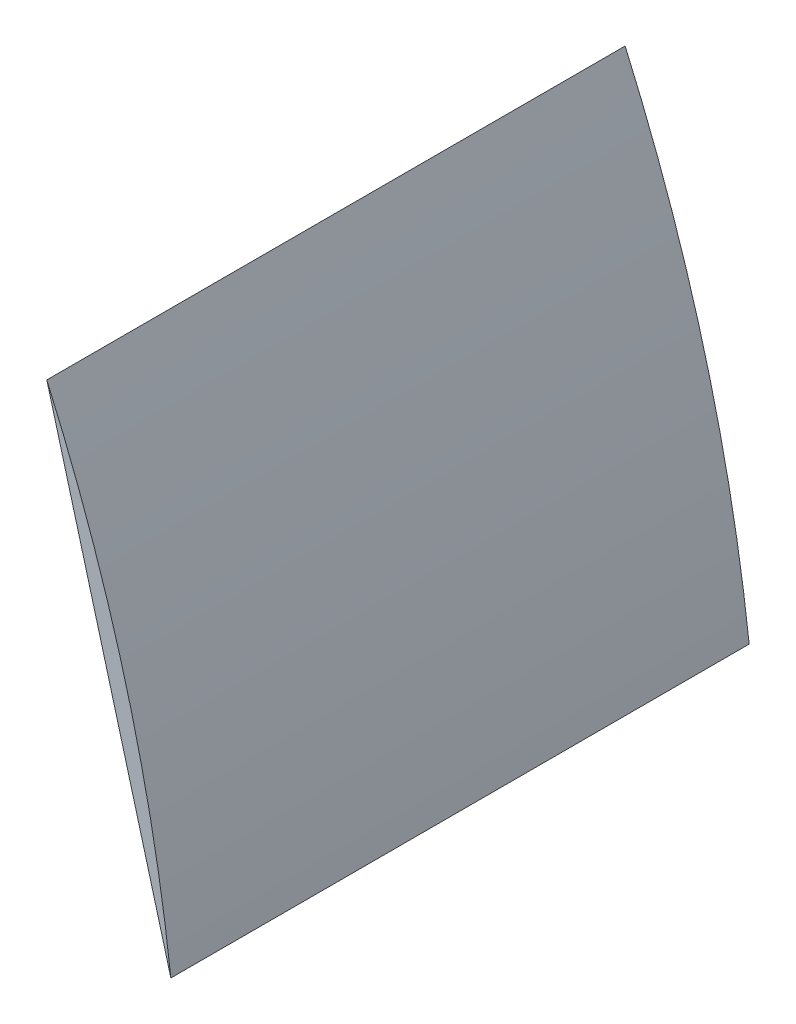
ISO-10303-21;
HEADER;
FILE_DESCRIPTION(('STEP AP214'),'2;1');
FILE_NAME('part.step','',(''),(''),'','','');
FILE_SCHEMA(('AUTOMOTIVE_DESIGN { 1 0 10303 214 1 1 1 1 }'));
ENDSEC;
DATA;
#1=APPLICATION_CONTEXT('core data for automotive mechanical design processes');
#2=APPLICATION_PROTOCOL_DEFINITION('international standard','automotive_design',2000,#1);
#3=PRODUCT_CONTEXT('',#1,'mechanical');
#4=PRODUCT('Part','Part','',(#3));
#5=PRODUCT_RELATED_PRODUCT_CATEGORY('part','',(#4));
#6=PRODUCT_DEFINITION_FORMATION('','',#4);
#7=PRODUCT_DEFINITION_CONTEXT('part definition',#1,'design');
#8=PRODUCT_DEFINITION('design','',#6,#7);
#9=PRODUCT_DEFINITION_SHAPE('','',#8);
#10=(LENGTH_UNIT() NAMED_UNIT(*) SI_UNIT(.MILLI.,.METRE.));
#11=(NAMED_UNIT(*) PLANE_ANGLE_UNIT() SI_UNIT($,.RADIAN.));
#12=(NAMED_UNIT(*) SI_UNIT($,.STERADIAN.) SOLID_ANGLE_UNIT());
#13=UNCERTAINTY_MEASURE_WITH_UNIT(LENGTH_MEASURE(1.E-05),#10,'distance_accuracy_value','');
#14=(GEOMETRIC_REPRESENTATION_CONTEXT(3) GLOBAL_UNCERTAINTY_ASSIGNED_CONTEXT((#13)) GLOBAL_UNIT_ASSIGNED_CONTEXT((#10,
#11,#12)) REPRESENTATION_CONTEXT('',''));
#15=CARTESIAN_POINT('',(0.,0.,0.));
#16=DIRECTION('',(0.,0.,1.));
#17=DIRECTION('',(1.,0.,0.));
#18=AXIS2_PLACEMENT_3D('',#15,#16,#17);
#19=CARTESIAN_POINT('',(-5.137,13.719,7.139));
#20=DIRECTION('',(0.,0.,-1.));
#21=DIRECTION('',(-1.,0.,0.));
#22=AXIS2_PLACEMENT_3D('',#19,#20,#21);
#23=CYLINDRICAL_SURFACE('',#22,19.731);
#24=CARTESIAN_POINT('',(-5.137,13.719,0.));
#25=DIRECTION('',(0.,0.,1.));
#26=DIRECTION('',(-1.,0.,0.));
#27=AXIS2_PLACEMENT_3D('',#24,#25,#26);
#28=CIRCLE('',#27,19.731);
#29=CARTESIAN_POINT('',(14.4584856264279,16.0275285496302,0.));
#30=VERTEX_POINT('',#29);
#31=CARTESIAN_POINT('',(12.9273076725018,21.6558223687564,0.));
#32=VERTEX_POINT('',#31);
#33=EDGE_CURVE('E74',#30,#32,#28,.T.);
#34=ORIENTED_EDGE('',*,*,#33,.T.);
#35=DIRECTION('',(0.,0.,-1.));
#36=VECTOR('',#35,1.);
#37=CARTESIAN_POINT('',(12.9273076725018,21.6558223687564,7.139));
#38=LINE('',#37,#36);
#39=CARTESIAN_POINT('',(12.9273076725018,21.6558223687564,7.139));
#40=VERTEX_POINT('',#39);
#41=EDGE_CURVE('E11',#40,#32,#38,.T.);
#42=ORIENTED_EDGE('',*,*,#41,.F.);
#43=CARTESIAN_POINT('',(-5.137,13.719,7.139));
#44=DIRECTION('',(0.,0.,1.));
#45=DIRECTION('',(-1.,0.,0.));
#46=AXIS2_PLACEMENT_3D('',#43,#44,#45);
#47=CIRCLE('',#46,19.731);
#48=CARTESIAN_POINT('',(14.4584856264279,16.0275285496302,7.139));
#49=VERTEX_POINT('',#48);
#50=EDGE_CURVE('E72',#49,#40,#47,.T.);
#51=ORIENTED_EDGE('',*,*,#50,.F.);
#52=DIRECTION('',(0.,0.,-1.));
#53=VECTOR('',#52,1.);
#54=CARTESIAN_POINT('',(14.4584856264279,16.0275285496302,7.139));
#55=LINE('',#54,#53);
#56=EDGE_CURVE('E47',#49,#30,#55,.T.);
#57=ORIENTED_EDGE('',*,*,#56,.T.);
#58=EDGE_LOOP('',(#34,#42,#51,#57));
#59=FACE_BOUND('',#58,.T.);
#60=ADVANCED_FACE('F41',(#59),#23,.T.);
#61=CARTESIAN_POINT('',(14.4584856264279,16.0275285496302,7.139));
#62=DIRECTION('',(0.964929496189798,0.262509175807063,0.));
#63=DIRECTION('',(-0.262509175807063,0.964929496189798,0.));
#64=AXIS2_PLACEMENT_3D('',#61,#62,#63);
#65=PLANE('',#64);
#66=DIRECTION('',(0.262509175807063,-0.964929496189798,0.));
#67=VECTOR('',#66,1.);
#68=CARTESIAN_POINT('',(14.4584856264279,16.0275285496302,0.));
#69=LINE('',#68,#67);
#70=EDGE_CURVE('E61',#32,#30,#69,.T.);
#71=ORIENTED_EDGE('',*,*,#70,.T.);
#72=ORIENTED_EDGE('',*,*,#56,.F.);
#73=DIRECTION('',(0.262509175807063,-0.964929496189798,0.));
#74=VECTOR('',#73,1.);
#75=CARTESIAN_POINT('',(14.4584856264279,16.0275285496302,7.139));
#76=LINE('',#75,#74);
#77=EDGE_CURVE('E57',#40,#49,#76,.T.);
#78=ORIENTED_EDGE('',*,*,#77,.F.);
#79=ORIENTED_EDGE('',*,*,#41,.T.);
#80=EDGE_LOOP('',(#71,#72,#78,#79));
#81=FACE_BOUND('',#80,.T.);
#82=ADVANCED_FACE('F70',(#81),#65,.F.);
#83=CARTESIAN_POINT('',(-5.137,13.719,7.139));
#84=DIRECTION('',(0.,0.,-1.));
#85=DIRECTION('',(-1.,0.,0.));
#86=AXIS2_PLACEMENT_3D('',#83,#84,#85);
#87=PLANE('',#86);
#88=ORIENTED_EDGE('',*,*,#50,.T.);
#89=ORIENTED_EDGE('',*,*,#77,.T.);
#90=EDGE_LOOP('',(#88,#89));
#91=FACE_BOUND('',#90,.T.);
#92=ADVANCED_FACE('F80',(#91),#87,.F.);
#93=CARTESIAN_POINT('',(-5.137,13.719,0.));
#94=DIRECTION('',(0.,0.,-1.));
#95=DIRECTION('',(-1.,0.,0.));
#96=AXIS2_PLACEMENT_3D('',#93,#94,#95);
#97=PLANE('',#96);
#98=ORIENTED_EDGE('',*,*,#33,.F.);
#99=ORIENTED_EDGE('',*,*,#70,.F.);
#100=EDGE_LOOP('',(#98,#99));
#101=FACE_BOUND('',#100,.T.);
#102=ADVANCED_FACE('F73',(#101),#97,.T.);
#103=CLOSED_SHELL('',(#60,#82,#92,#102));
#104=MANIFOLD_SOLID_BREP('B2',#103);
#105=ADVANCED_BREP_SHAPE_REPRESENTATION('',(#18,#104),#14);
#106=SHAPE_DEFINITION_REPRESENTATION(#9,#105);
ENDSEC;
END-ISO-10303-21;
